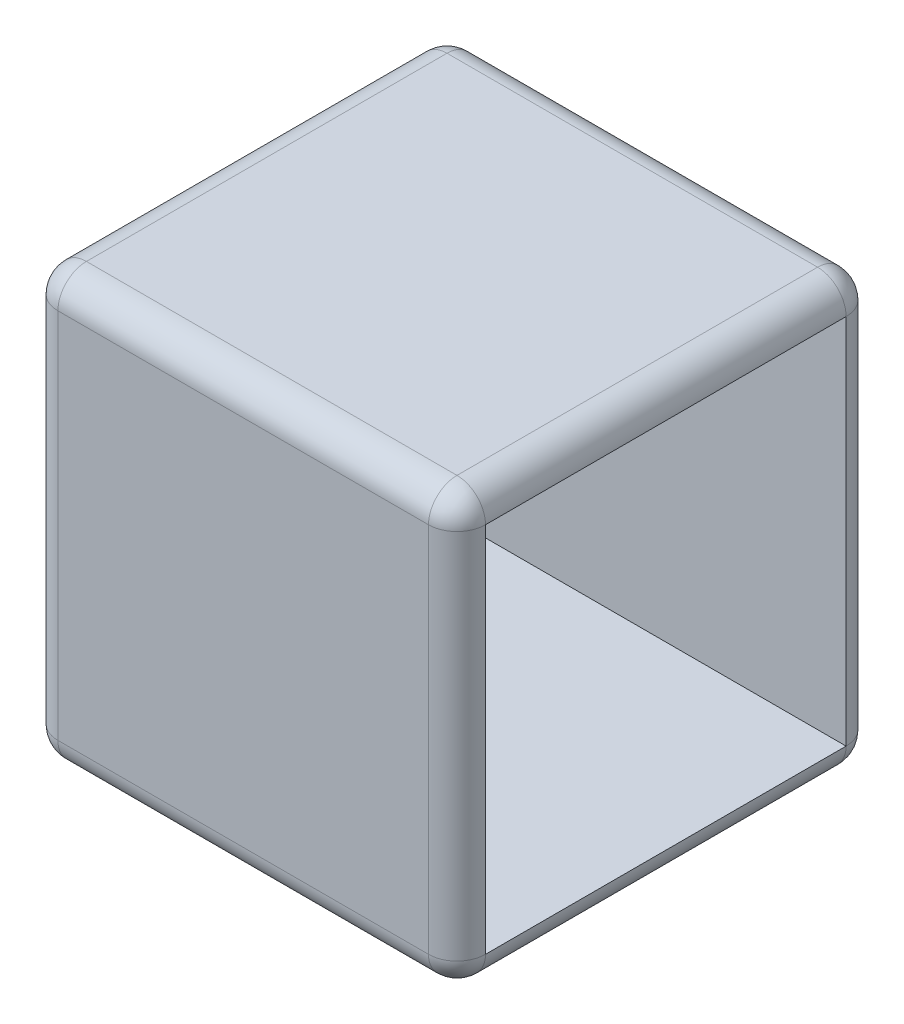
ISO-10303-21;
HEADER;
FILE_DESCRIPTION(('STEP AP214'),'2;1');
FILE_NAME('part.step','',(''),(''),'','','');
FILE_SCHEMA(('AUTOMOTIVE_DESIGN { 1 0 10303 214 1 1 1 1 }'));
ENDSEC;
DATA;
#1=APPLICATION_CONTEXT('core data for automotive mechanical design processes');
#2=APPLICATION_PROTOCOL_DEFINITION('international standard','automotive_design',2000,#1);
#3=PRODUCT_CONTEXT('',#1,'mechanical');
#4=PRODUCT('Part','Part','',(#3));
#5=PRODUCT_RELATED_PRODUCT_CATEGORY('part','',(#4));
#6=PRODUCT_DEFINITION_FORMATION('','',#4);
#7=PRODUCT_DEFINITION_CONTEXT('part definition',#1,'design');
#8=PRODUCT_DEFINITION('design','',#6,#7);
#9=PRODUCT_DEFINITION_SHAPE('','',#8);
#10=(LENGTH_UNIT() NAMED_UNIT(*) SI_UNIT(.MILLI.,.METRE.));
#11=(NAMED_UNIT(*) PLANE_ANGLE_UNIT() SI_UNIT($,.RADIAN.));
#12=(NAMED_UNIT(*) SI_UNIT($,.STERADIAN.) SOLID_ANGLE_UNIT());
#13=UNCERTAINTY_MEASURE_WITH_UNIT(LENGTH_MEASURE(1.E-05),#10,'distance_accuracy_value','');
#14=(GEOMETRIC_REPRESENTATION_CONTEXT(3) GLOBAL_UNCERTAINTY_ASSIGNED_CONTEXT((#13)) GLOBAL_UNIT_ASSIGNED_CONTEXT((#10,
#11,#12)) REPRESENTATION_CONTEXT('',''));
#15=CARTESIAN_POINT('',(0.,0.,0.));
#16=DIRECTION('',(0.,0.,1.));
#17=DIRECTION('',(1.,0.,0.));
#18=AXIS2_PLACEMENT_3D('',#15,#16,#17);
#19=CARTESIAN_POINT('',(15.,30.1,14.6499999999998));
#20=DIRECTION('',(0.,0.,1.));
#21=DIRECTION('',(1.,0.,0.));
#22=AXIS2_PLACEMENT_3D('',#19,#20,#21);
#23=PLANE('',#22);
#24=DIRECTION('',(-1.,0.,0.));
#25=VECTOR('',#24,1.);
#26=CARTESIAN_POINT('',(-15.,28.1,14.6499999999998));
#27=LINE('',#26,#25);
#28=CARTESIAN_POINT('',(13.,28.1,14.6499999999998));
#29=VERTEX_POINT('',#28);
#30=CARTESIAN_POINT('',(-13.,28.1,14.6499999999998));
#31=VERTEX_POINT('',#30);
#32=EDGE_CURVE('E207',#29,#31,#27,.T.);
#33=ORIENTED_EDGE('',*,*,#32,.T.);
#34=DIRECTION('',(0.,-1.,0.));
#35=VECTOR('',#34,1.);
#36=CARTESIAN_POINT('',(-13.,30.1,14.6499999999998));
#37=LINE('',#36,#35);
#38=CARTESIAN_POINT('',(-13.,2.,14.6499999999998));
#39=VERTEX_POINT('',#38);
#40=EDGE_CURVE('E209',#31,#39,#37,.T.);
#41=ORIENTED_EDGE('',*,*,#40,.T.);
#42=DIRECTION('',(-1.,0.,0.));
#43=VECTOR('',#42,1.);
#44=CARTESIAN_POINT('',(15.,2.,14.6499999999998));
#45=LINE('',#44,#43);
#46=CARTESIAN_POINT('',(13.,2.,14.6499999999998));
#47=VERTEX_POINT('',#46);
#48=EDGE_CURVE('E203',#39,#47,#45,.F.);
#49=ORIENTED_EDGE('',*,*,#48,.T.);
#50=DIRECTION('',(0.,-1.,0.));
#51=VECTOR('',#50,1.);
#52=CARTESIAN_POINT('',(13.,30.1,14.6499999999998));
#53=LINE('',#52,#51);
#54=EDGE_CURVE('E205',#47,#29,#53,.F.);
#55=ORIENTED_EDGE('',*,*,#54,.T.);
#56=EDGE_LOOP('',(#33,#41,#49,#55));
#57=FACE_BOUND('',#56,.T.);
#58=ADVANCED_FACE('F40',(#57),#23,.T.);
#59=CARTESIAN_POINT('',(15.,30.1,-14.6500000000001));
#60=DIRECTION('',(0.,0.,1.));
#61=DIRECTION('',(1.,0.,0.));
#62=AXIS2_PLACEMENT_3D('',#59,#60,#61);
#63=PLANE('',#62);
#64=DIRECTION('',(-1.,0.,0.));
#65=VECTOR('',#64,1.);
#66=CARTESIAN_POINT('',(15.,28.1,-14.6500000000001));
#67=LINE('',#66,#65);
#68=CARTESIAN_POINT('',(-13.,28.1,-14.6500000000001));
#69=VERTEX_POINT('',#68);
#70=CARTESIAN_POINT('',(13.,28.1,-14.6500000000001));
#71=VERTEX_POINT('',#70);
#72=EDGE_CURVE('E49',#69,#71,#67,.F.);
#73=ORIENTED_EDGE('',*,*,#72,.T.);
#74=DIRECTION('',(0.,-1.,0.));
#75=VECTOR('',#74,1.);
#76=CARTESIAN_POINT('',(13.,30.1,-14.6500000000001));
#77=LINE('',#76,#75);
#78=CARTESIAN_POINT('',(13.,2.,-14.6500000000001));
#79=VERTEX_POINT('',#78);
#80=EDGE_CURVE('E11',#71,#79,#77,.T.);
#81=ORIENTED_EDGE('',*,*,#80,.T.);
#82=DIRECTION('',(-1.,0.,0.));
#83=VECTOR('',#82,1.);
#84=CARTESIAN_POINT('',(-15.,2.,-14.6500000000001));
#85=LINE('',#84,#83);
#86=CARTESIAN_POINT('',(-13.,2.,-14.6500000000001));
#87=VERTEX_POINT('',#86);
#88=EDGE_CURVE('E221',#79,#87,#85,.T.);
#89=ORIENTED_EDGE('',*,*,#88,.T.);
#90=DIRECTION('',(0.,-1.,0.));
#91=VECTOR('',#90,1.);
#92=CARTESIAN_POINT('',(-13.,30.1,-14.6500000000001));
#93=LINE('',#92,#91);
#94=EDGE_CURVE('E60',#87,#69,#93,.F.);
#95=ORIENTED_EDGE('',*,*,#94,.T.);
#96=EDGE_LOOP('',(#73,#81,#89,#95));
#97=FACE_BOUND('',#96,.T.);
#98=ADVANCED_FACE('F300',(#97),#63,.F.);
#99=CARTESIAN_POINT('',(-15.,30.1,14.6499999999998));
#100=DIRECTION('',(-1.,0.,0.));
#101=DIRECTION('',(0.,0.,1.));
#102=AXIS2_PLACEMENT_3D('',#99,#100,#101);
#103=PLANE('',#102);
#104=DIRECTION('',(0.,-1.,0.));
#105=VECTOR('',#104,1.);
#106=CARTESIAN_POINT('',(-15.,30.1,12.6499999999998));
#107=LINE('',#106,#105);
#108=CARTESIAN_POINT('',(-15.,2.,12.6499999999998));
#109=VERTEX_POINT('',#108);
#110=CARTESIAN_POINT('',(-15.,28.1,12.6499999999998));
#111=VERTEX_POINT('',#110);
#112=EDGE_CURVE('E189',#109,#111,#107,.F.);
#113=ORIENTED_EDGE('',*,*,#112,.T.);
#114=DIRECTION('',(0.,0.,-1.));
#115=VECTOR('',#114,1.);
#116=CARTESIAN_POINT('',(-15.,28.1,-14.6500000000001));
#117=LINE('',#116,#115);
#118=CARTESIAN_POINT('',(-15.,28.1,-12.6500000000001));
#119=VERTEX_POINT('',#118);
#120=EDGE_CURVE('E191',#111,#119,#117,.T.);
#121=ORIENTED_EDGE('',*,*,#120,.T.);
#122=DIRECTION('',(0.,-1.,0.));
#123=VECTOR('',#122,1.);
#124=CARTESIAN_POINT('',(-15.,0.,-12.6500000000001));
#125=LINE('',#124,#123);
#126=CARTESIAN_POINT('',(-15.,2.,-12.6500000000001));
#127=VERTEX_POINT('',#126);
#128=EDGE_CURVE('E180',#119,#127,#125,.T.);
#129=ORIENTED_EDGE('',*,*,#128,.T.);
#130=DIRECTION('',(0.,0.,-1.));
#131=VECTOR('',#130,1.);
#132=CARTESIAN_POINT('',(-15.,2.,14.6499999999998));
#133=LINE('',#132,#131);
#134=EDGE_CURVE('E187',#127,#109,#133,.F.);
#135=ORIENTED_EDGE('',*,*,#134,.T.);
#136=EDGE_LOOP('',(#113,#121,#129,#135));
#137=FACE_BOUND('',#136,.T.);
#138=ADVANCED_FACE('F344',(#137),#103,.T.);
#139=CARTESIAN_POINT('',(0.,30.1,0.));
#140=DIRECTION('',(0.,-1.,0.));
#141=DIRECTION('',(0.,0.,-1.));
#142=AXIS2_PLACEMENT_3D('',#139,#140,#141);
#143=PLANE('',#142);
#144=DIRECTION('',(0.,0.,-1.));
#145=VECTOR('',#144,1.);
#146=CARTESIAN_POINT('',(-13.,30.1,14.6499999999998));
#147=LINE('',#146,#145);
#148=CARTESIAN_POINT('',(-13.,30.1,-12.6500000000001));
#149=VERTEX_POINT('',#148);
#150=CARTESIAN_POINT('',(-13.,30.1,12.6499999999998));
#151=VERTEX_POINT('',#150);
#152=EDGE_CURVE('E198',#149,#151,#147,.F.);
#153=ORIENTED_EDGE('',*,*,#152,.T.);
#154=DIRECTION('',(-1.,0.,0.));
#155=VECTOR('',#154,1.);
#156=CARTESIAN_POINT('',(15.,30.1,12.6499999999998));
#157=LINE('',#156,#155);
#158=CARTESIAN_POINT('',(13.,30.1,12.6499999999998));
#159=VERTEX_POINT('',#158);
#160=EDGE_CURVE('E201',#151,#159,#157,.F.);
#161=ORIENTED_EDGE('',*,*,#160,.T.);
#162=DIRECTION('',(0.,0.,-1.));
#163=VECTOR('',#162,1.);
#164=CARTESIAN_POINT('',(13.,30.1,0.));
#165=LINE('',#164,#163);
#166=CARTESIAN_POINT('',(13.,30.1,-12.6500000000001));
#167=VERTEX_POINT('',#166);
#168=EDGE_CURVE('E196',#159,#167,#165,.T.);
#169=ORIENTED_EDGE('',*,*,#168,.T.);
#170=DIRECTION('',(-1.,0.,0.));
#171=VECTOR('',#170,1.);
#172=CARTESIAN_POINT('',(0.,30.1,-12.6500000000001));
#173=LINE('',#172,#171);
#174=EDGE_CURVE('E194',#167,#149,#173,.T.);
#175=ORIENTED_EDGE('',*,*,#174,.T.);
#176=EDGE_LOOP('',(#153,#161,#169,#175));
#177=FACE_BOUND('',#176,.T.);
#178=ADVANCED_FACE('F315',(#177),#143,.F.);
#179=CARTESIAN_POINT('',(0.,0.,0.));
#180=DIRECTION('',(0.,-1.,0.));
#181=DIRECTION('',(0.,0.,-1.));
#182=AXIS2_PLACEMENT_3D('',#179,#180,#181);
#183=PLANE('',#182);
#184=DIRECTION('',(0.,0.,-1.));
#185=VECTOR('',#184,1.);
#186=CARTESIAN_POINT('',(13.,0.,14.6499999999998));
#187=LINE('',#186,#185);
#188=CARTESIAN_POINT('',(13.,0.,-12.6500000000001));
#189=VERTEX_POINT('',#188);
#190=CARTESIAN_POINT('',(13.,0.,12.6499999999998));
#191=VERTEX_POINT('',#190);
#192=EDGE_CURVE('E216',#189,#191,#187,.F.);
#193=ORIENTED_EDGE('',*,*,#192,.T.);
#194=DIRECTION('',(-1.,0.,0.));
#195=VECTOR('',#194,1.);
#196=CARTESIAN_POINT('',(0.,0.,12.6499999999998));
#197=LINE('',#196,#195);
#198=CARTESIAN_POINT('',(-13.,0.,12.6499999999998));
#199=VERTEX_POINT('',#198);
#200=EDGE_CURVE('E219',#191,#199,#197,.T.);
#201=ORIENTED_EDGE('',*,*,#200,.T.);
#202=DIRECTION('',(0.,0.,-1.));
#203=VECTOR('',#202,1.);
#204=CARTESIAN_POINT('',(-13.,0.,0.));
#205=LINE('',#204,#203);
#206=CARTESIAN_POINT('',(-13.,0.,-12.6500000000001));
#207=VERTEX_POINT('',#206);
#208=EDGE_CURVE('E214',#199,#207,#205,.T.);
#209=ORIENTED_EDGE('',*,*,#208,.T.);
#210=DIRECTION('',(-1.,0.,0.));
#211=VECTOR('',#210,1.);
#212=CARTESIAN_POINT('',(15.,0.,-12.6500000000001));
#213=LINE('',#212,#211);
#214=EDGE_CURVE('E212',#207,#189,#213,.F.);
#215=ORIENTED_EDGE('',*,*,#214,.T.);
#216=EDGE_LOOP('',(#193,#201,#209,#215));
#217=FACE_BOUND('',#216,.T.);
#218=ADVANCED_FACE('F335',(#217),#183,.T.);
#219=CARTESIAN_POINT('',(15.,30.1,12.6499999999998));
#220=DIRECTION('',(0.,0.,1.));
#221=DIRECTION('',(1.,0.,0.));
#222=AXIS2_PLACEMENT_3D('',#219,#220,#221);
#223=PLANE('',#222);
#224=DIRECTION('',(-1.,0.,0.));
#225=VECTOR('',#224,1.);
#226=CARTESIAN_POINT('',(0.,2.,12.6499999999998));
#227=LINE('',#226,#225);
#228=CARTESIAN_POINT('',(15.,2.,12.6499999999998));
#229=VERTEX_POINT('',#228);
#230=CARTESIAN_POINT('',(-13.,2.,12.6499999999998));
#231=VERTEX_POINT('',#230);
#232=EDGE_CURVE('E158',#229,#231,#227,.T.);
#233=ORIENTED_EDGE('',*,*,#232,.T.);
#234=DIRECTION('',(0.,-1.,0.));
#235=VECTOR('',#234,1.);
#236=CARTESIAN_POINT('',(-13.,30.1,12.6499999999998));
#237=LINE('',#236,#235);
#238=CARTESIAN_POINT('',(-13.,28.1,12.6499999999998));
#239=VERTEX_POINT('',#238);
#240=EDGE_CURVE('E140',#239,#231,#237,.T.);
#241=ORIENTED_EDGE('',*,*,#240,.F.);
#242=DIRECTION('',(-1.,0.,0.));
#243=VECTOR('',#242,1.);
#244=CARTESIAN_POINT('',(0.,28.1,12.6499999999998));
#245=LINE('',#244,#243);
#246=CARTESIAN_POINT('',(15.,28.1,12.6499999999998));
#247=VERTEX_POINT('',#246);
#248=EDGE_CURVE('E170',#247,#239,#245,.T.);
#249=ORIENTED_EDGE('',*,*,#248,.F.);
#250=DIRECTION('',(0.,-1.,0.));
#251=VECTOR('',#250,1.);
#252=CARTESIAN_POINT('',(15.,30.1,12.6499999999998));
#253=LINE('',#252,#251);
#254=EDGE_CURVE('E165',#247,#229,#253,.T.);
#255=ORIENTED_EDGE('',*,*,#254,.T.);
#256=EDGE_LOOP('',(#233,#241,#249,#255));
#257=FACE_BOUND('',#256,.T.);
#258=ADVANCED_FACE('F163',(#257),#223,.F.);
#259=CARTESIAN_POINT('',(15.,30.1,-12.6500000000001));
#260=DIRECTION('',(0.,0.,1.));
#261=DIRECTION('',(1.,0.,0.));
#262=AXIS2_PLACEMENT_3D('',#259,#260,#261);
#263=PLANE('',#262);
#264=DIRECTION('',(-1.,0.,0.));
#265=VECTOR('',#264,1.);
#266=CARTESIAN_POINT('',(0.,2.,-12.6500000000001));
#267=LINE('',#266,#265);
#268=CARTESIAN_POINT('',(15.,2.,-12.6500000000001));
#269=VERTEX_POINT('',#268);
#270=CARTESIAN_POINT('',(-13.,2.,-12.6500000000001));
#271=VERTEX_POINT('',#270);
#272=EDGE_CURVE('E161',#269,#271,#267,.T.);
#273=ORIENTED_EDGE('',*,*,#272,.F.);
#274=DIRECTION('',(0.,-1.,0.));
#275=VECTOR('',#274,1.);
#276=CARTESIAN_POINT('',(15.,30.1,-12.6500000000001));
#277=LINE('',#276,#275);
#278=CARTESIAN_POINT('',(15.,28.1,-12.6500000000001));
#279=VERTEX_POINT('',#278);
#280=EDGE_CURVE('E176',#279,#269,#277,.T.);
#281=ORIENTED_EDGE('',*,*,#280,.F.);
#282=DIRECTION('',(-1.,0.,0.));
#283=VECTOR('',#282,1.);
#284=CARTESIAN_POINT('',(0.,28.1,-12.6500000000001));
#285=LINE('',#284,#283);
#286=CARTESIAN_POINT('',(-13.,28.1,-12.6500000000001));
#287=VERTEX_POINT('',#286);
#288=EDGE_CURVE('E174',#279,#287,#285,.T.);
#289=ORIENTED_EDGE('',*,*,#288,.T.);
#290=DIRECTION('',(0.,-1.,0.));
#291=VECTOR('',#290,1.);
#292=CARTESIAN_POINT('',(-13.,30.1,-12.6500000000001));
#293=LINE('',#292,#291);
#294=EDGE_CURVE('E151',#287,#271,#293,.T.);
#295=ORIENTED_EDGE('',*,*,#294,.T.);
#296=EDGE_LOOP('',(#273,#281,#289,#295));
#297=FACE_BOUND('',#296,.T.);
#298=ADVANCED_FACE('F326',(#297),#263,.T.);
#299=CARTESIAN_POINT('',(-13.,30.1,14.6499999999998));
#300=DIRECTION('',(-1.,0.,0.));
#301=DIRECTION('',(0.,0.,1.));
#302=AXIS2_PLACEMENT_3D('',#299,#300,#301);
#303=PLANE('',#302);
#304=DIRECTION('',(0.,0.,-1.));
#305=VECTOR('',#304,1.);
#306=CARTESIAN_POINT('',(-13.,2.,0.));
#307=LINE('',#306,#305);
#308=EDGE_CURVE('E144',#231,#271,#307,.T.);
#309=ORIENTED_EDGE('',*,*,#308,.T.);
#310=ORIENTED_EDGE('',*,*,#294,.F.);
#311=DIRECTION('',(0.,0.,-1.));
#312=VECTOR('',#311,1.);
#313=CARTESIAN_POINT('',(-13.,28.1,0.));
#314=LINE('',#313,#312);
#315=EDGE_CURVE('E146',#239,#287,#314,.T.);
#316=ORIENTED_EDGE('',*,*,#315,.F.);
#317=ORIENTED_EDGE('',*,*,#240,.T.);
#318=EDGE_LOOP('',(#309,#310,#316,#317));
#319=FACE_BOUND('',#318,.T.);
#320=ADVANCED_FACE('F142',(#319),#303,.F.);
#321=CARTESIAN_POINT('',(0.,28.1,0.));
#322=DIRECTION('',(0.,-1.,0.));
#323=DIRECTION('',(0.,0.,-1.));
#324=AXIS2_PLACEMENT_3D('',#321,#322,#323);
#325=PLANE('',#324);
#326=ORIENTED_EDGE('',*,*,#248,.T.);
#327=ORIENTED_EDGE('',*,*,#315,.T.);
#328=ORIENTED_EDGE('',*,*,#288,.F.);
#329=DIRECTION('',(0.,0.,-1.));
#330=VECTOR('',#329,1.);
#331=CARTESIAN_POINT('',(15.,28.1,0.));
#332=LINE('',#331,#330);
#333=EDGE_CURVE('E152',#247,#279,#332,.T.);
#334=ORIENTED_EDGE('',*,*,#333,.F.);
#335=EDGE_LOOP('',(#326,#327,#328,#334));
#336=FACE_BOUND('',#335,.T.);
#337=ADVANCED_FACE('F324',(#336),#325,.T.);
#338=CARTESIAN_POINT('',(0.,2.,0.));
#339=DIRECTION('',(0.,-1.,0.));
#340=DIRECTION('',(0.,0.,-1.));
#341=AXIS2_PLACEMENT_3D('',#338,#339,#340);
#342=PLANE('',#341);
#343=ORIENTED_EDGE('',*,*,#232,.F.);
#344=DIRECTION('',(0.,0.,-1.));
#345=VECTOR('',#344,1.);
#346=CARTESIAN_POINT('',(15.,2.,0.));
#347=LINE('',#346,#345);
#348=EDGE_CURVE('E171',#229,#269,#347,.T.);
#349=ORIENTED_EDGE('',*,*,#348,.T.);
#350=ORIENTED_EDGE('',*,*,#272,.T.);
#351=ORIENTED_EDGE('',*,*,#308,.F.);
#352=EDGE_LOOP('',(#343,#349,#350,#351));
#353=FACE_BOUND('',#352,.T.);
#354=ADVANCED_FACE('F157',(#353),#342,.F.);
#355=CARTESIAN_POINT('',(13.,2.,14.6499999999998));
#356=DIRECTION('',(0.,0.,1.));
#357=DIRECTION('',(1.,0.,0.));
#358=AXIS2_PLACEMENT_3D('',#355,#356,#357);
#359=CYLINDRICAL_SURFACE('',#358,2.);
#360=CARTESIAN_POINT('',(13.,2.,12.6499999999998));
#361=DIRECTION('',(0.,0.,1.));
#362=DIRECTION('',(1.,0.,0.));
#363=AXIS2_PLACEMENT_3D('',#360,#361,#362);
#364=CIRCLE('',#363,2.);
#365=EDGE_CURVE('E44',#191,#229,#364,.T.);
#366=ORIENTED_EDGE('',*,*,#365,.F.);
#367=ORIENTED_EDGE('',*,*,#192,.F.);
#368=CARTESIAN_POINT('',(13.,2.,-12.6500000000001));
#369=DIRECTION('',(0.,0.,-1.));
#370=DIRECTION('',(-1.,0.,0.));
#371=AXIS2_PLACEMENT_3D('',#368,#369,#370);
#372=CIRCLE('',#371,2.);
#373=EDGE_CURVE('E168',#269,#189,#372,.T.);
#374=ORIENTED_EDGE('',*,*,#373,.F.);
#375=ORIENTED_EDGE('',*,*,#348,.F.);
#376=EDGE_LOOP('',(#366,#367,#374,#375));
#377=FACE_BOUND('',#376,.T.);
#378=ADVANCED_FACE('F42',(#377),#359,.T.);
#379=CARTESIAN_POINT('',(13.,2.,12.6499999999998));
#380=DIRECTION('',(1.,0.,0.));
#381=DIRECTION('',(0.,1.,0.));
#382=AXIS2_PLACEMENT_3D('',#379,#380,#381);
#383=SPHERICAL_SURFACE('',#382,2.);
#384=CARTESIAN_POINT('',(13.,2.,12.6499999999998));
#385=DIRECTION('',(1.,0.,0.));
#386=DIRECTION('',(0.,0.,-1.));
#387=AXIS2_PLACEMENT_3D('',#384,#385,#386);
#388=CIRCLE('',#387,2.);
#389=EDGE_CURVE('E281',#191,#47,#388,.F.);
#390=ORIENTED_EDGE('',*,*,#389,.F.);
#391=ORIENTED_EDGE('',*,*,#365,.T.);
#392=CARTESIAN_POINT('',(13.,2.,12.6499999999998));
#393=DIRECTION('',(0.,-1.,0.));
#394=DIRECTION('',(0.,0.,-1.));
#395=AXIS2_PLACEMENT_3D('',#392,#393,#394);
#396=CIRCLE('',#395,2.);
#397=EDGE_CURVE('E284',#47,#229,#396,.F.);
#398=ORIENTED_EDGE('',*,*,#397,.F.);
#399=EDGE_LOOP('',(#390,#391,#398));
#400=FACE_BOUND('',#399,.T.);
#401=ADVANCED_FACE('F407',(#400),#383,.T.);
#402=CARTESIAN_POINT('',(13.,2.,-12.6500000000001));
#403=DIRECTION('',(0.,-1.,0.));
#404=DIRECTION('',(0.,0.,-1.));
#405=AXIS2_PLACEMENT_3D('',#402,#403,#404);
#406=SPHERICAL_SURFACE('',#405,2.);
#407=CARTESIAN_POINT('',(13.,2.,-12.6500000000001));
#408=DIRECTION('',(0.,-1.,0.));
#409=DIRECTION('',(0.,0.,-1.));
#410=AXIS2_PLACEMENT_3D('',#407,#408,#409);
#411=CIRCLE('',#410,2.);
#412=EDGE_CURVE('E275',#269,#79,#411,.F.);
#413=ORIENTED_EDGE('',*,*,#412,.F.);
#414=ORIENTED_EDGE('',*,*,#373,.T.);
#415=CARTESIAN_POINT('',(13.,2.,-12.6500000000001));
#416=DIRECTION('',(1.,0.,0.));
#417=DIRECTION('',(0.,0.,-1.));
#418=AXIS2_PLACEMENT_3D('',#415,#416,#417);
#419=CIRCLE('',#418,2.);
#420=EDGE_CURVE('E278',#79,#189,#419,.F.);
#421=ORIENTED_EDGE('',*,*,#420,.F.);
#422=EDGE_LOOP('',(#413,#414,#421));
#423=FACE_BOUND('',#422,.T.);
#424=ADVANCED_FACE('F291',(#423),#406,.T.);
#425=CARTESIAN_POINT('',(13.,30.1,12.6499999999998));
#426=DIRECTION('',(0.,1.,0.));
#427=DIRECTION('',(0.,0.,1.));
#428=AXIS2_PLACEMENT_3D('',#425,#426,#427);
#429=CYLINDRICAL_SURFACE('',#428,2.);
#430=ORIENTED_EDGE('',*,*,#397,.T.);
#431=ORIENTED_EDGE('',*,*,#254,.F.);
#432=CARTESIAN_POINT('',(13.,28.1,12.6499999999998));
#433=DIRECTION('',(0.,1.,0.));
#434=DIRECTION('',(0.,0.,1.));
#435=AXIS2_PLACEMENT_3D('',#432,#433,#434);
#436=CIRCLE('',#435,2.);
#437=EDGE_CURVE('E270',#29,#247,#436,.T.);
#438=ORIENTED_EDGE('',*,*,#437,.F.);
#439=ORIENTED_EDGE('',*,*,#54,.F.);
#440=EDGE_LOOP('',(#430,#431,#438,#439));
#441=FACE_BOUND('',#440,.T.);
#442=ADVANCED_FACE('F401',(#441),#429,.T.);
#443=CARTESIAN_POINT('',(0.,2.,12.6499999999998));
#444=DIRECTION('',(-1.,0.,0.));
#445=DIRECTION('',(0.,0.,1.));
#446=AXIS2_PLACEMENT_3D('',#443,#444,#445);
#447=CYLINDRICAL_SURFACE('',#446,2.);
#448=ORIENTED_EDGE('',*,*,#389,.T.);
#449=ORIENTED_EDGE('',*,*,#48,.F.);
#450=CARTESIAN_POINT('',(-13.,2.,12.6499999999998));
#451=DIRECTION('',(-1.,0.,0.));
#452=DIRECTION('',(0.,0.,1.));
#453=AXIS2_PLACEMENT_3D('',#450,#451,#452);
#454=CIRCLE('',#453,2.);
#455=EDGE_CURVE('E267',#199,#39,#454,.T.);
#456=ORIENTED_EDGE('',*,*,#455,.F.);
#457=ORIENTED_EDGE('',*,*,#200,.F.);
#458=EDGE_LOOP('',(#448,#449,#456,#457));
#459=FACE_BOUND('',#458,.T.);
#460=ADVANCED_FACE('F397',(#459),#447,.T.);
#461=CARTESIAN_POINT('',(-13.,2.,0.));
#462=DIRECTION('',(0.,0.,-1.));
#463=DIRECTION('',(-1.,0.,0.));
#464=AXIS2_PLACEMENT_3D('',#461,#462,#463);
#465=CYLINDRICAL_SURFACE('',#464,2.);
#466=CARTESIAN_POINT('',(-13.,2.,-12.6500000000001));
#467=DIRECTION('',(0.,0.,-1.));
#468=DIRECTION('',(-1.,0.,0.));
#469=AXIS2_PLACEMENT_3D('',#466,#467,#468);
#470=CIRCLE('',#469,2.);
#471=EDGE_CURVE('E261',#207,#127,#470,.T.);
#472=ORIENTED_EDGE('',*,*,#471,.F.);
#473=ORIENTED_EDGE('',*,*,#208,.F.);
#474=CARTESIAN_POINT('',(-13.,2.,12.6499999999998));
#475=DIRECTION('',(0.,0.,1.));
#476=DIRECTION('',(1.,0.,0.));
#477=AXIS2_PLACEMENT_3D('',#474,#475,#476);
#478=CIRCLE('',#477,2.);
#479=EDGE_CURVE('E264',#109,#199,#478,.T.);
#480=ORIENTED_EDGE('',*,*,#479,.F.);
#481=ORIENTED_EDGE('',*,*,#134,.F.);
#482=EDGE_LOOP('',(#472,#473,#480,#481));
#483=FACE_BOUND('',#482,.T.);
#484=ADVANCED_FACE('F394',(#483),#465,.T.);
#485=CARTESIAN_POINT('',(15.,2.,-12.6500000000001));
#486=DIRECTION('',(1.,0.,0.));
#487=DIRECTION('',(0.,0.,-1.));
#488=AXIS2_PLACEMENT_3D('',#485,#486,#487);
#489=CYLINDRICAL_SURFACE('',#488,2.);
#490=ORIENTED_EDGE('',*,*,#420,.T.);
#491=ORIENTED_EDGE('',*,*,#214,.F.);
#492=CARTESIAN_POINT('',(-13.,2.,-12.6500000000001));
#493=DIRECTION('',(-1.,0.,0.));
#494=DIRECTION('',(0.,0.,1.));
#495=AXIS2_PLACEMENT_3D('',#492,#493,#494);
#496=CIRCLE('',#495,2.);
#497=EDGE_CURVE('E258',#87,#207,#496,.T.);
#498=ORIENTED_EDGE('',*,*,#497,.F.);
#499=ORIENTED_EDGE('',*,*,#88,.F.);
#500=EDGE_LOOP('',(#490,#491,#498,#499));
#501=FACE_BOUND('',#500,.T.);
#502=ADVANCED_FACE('F296',(#501),#489,.T.);
#503=CARTESIAN_POINT('',(13.,30.1,-12.6500000000001));
#504=DIRECTION('',(0.,-1.,0.));
#505=DIRECTION('',(0.,0.,-1.));
#506=AXIS2_PLACEMENT_3D('',#503,#504,#505);
#507=CYLINDRICAL_SURFACE('',#506,2.);
#508=ORIENTED_EDGE('',*,*,#412,.T.);
#509=ORIENTED_EDGE('',*,*,#80,.F.);
#510=CARTESIAN_POINT('',(13.,28.1,-12.6500000000001));
#511=DIRECTION('',(0.,1.,0.));
#512=DIRECTION('',(0.,0.,1.));
#513=AXIS2_PLACEMENT_3D('',#510,#511,#512);
#514=CIRCLE('',#513,2.);
#515=EDGE_CURVE('E255',#279,#71,#514,.T.);
#516=ORIENTED_EDGE('',*,*,#515,.F.);
#517=ORIENTED_EDGE('',*,*,#280,.T.);
#518=EDGE_LOOP('',(#508,#509,#516,#517));
#519=FACE_BOUND('',#518,.T.);
#520=ADVANCED_FACE('F303',(#519),#507,.T.);
#521=CARTESIAN_POINT('',(13.,28.1,0.));
#522=DIRECTION('',(0.,0.,-1.));
#523=DIRECTION('',(-1.,0.,0.));
#524=AXIS2_PLACEMENT_3D('',#521,#522,#523);
#525=CYLINDRICAL_SURFACE('',#524,2.);
#526=CARTESIAN_POINT('',(13.,28.1,12.6499999999998));
#527=DIRECTION('',(0.,0.,1.));
#528=DIRECTION('',(1.,0.,0.));
#529=AXIS2_PLACEMENT_3D('',#526,#527,#528);
#530=CIRCLE('',#529,2.);
#531=EDGE_CURVE('E272',#247,#159,#530,.T.);
#532=ORIENTED_EDGE('',*,*,#531,.F.);
#533=ORIENTED_EDGE('',*,*,#333,.T.);
#534=CARTESIAN_POINT('',(13.,28.1,-12.6500000000001));
#535=DIRECTION('',(0.,0.,-1.));
#536=DIRECTION('',(-1.,0.,0.));
#537=AXIS2_PLACEMENT_3D('',#534,#535,#536);
#538=CIRCLE('',#537,2.);
#539=EDGE_CURVE('E252',#167,#279,#538,.T.);
#540=ORIENTED_EDGE('',*,*,#539,.F.);
#541=ORIENTED_EDGE('',*,*,#168,.F.);
#542=EDGE_LOOP('',(#532,#533,#540,#541));
#543=FACE_BOUND('',#542,.T.);
#544=ADVANCED_FACE('F320',(#543),#525,.T.);
#545=CARTESIAN_POINT('',(13.,28.1,12.6499999999998));
#546=DIRECTION('',(1.,0.,0.));
#547=DIRECTION('',(0.,0.,-1.));
#548=AXIS2_PLACEMENT_3D('',#545,#546,#547);
#549=SPHERICAL_SURFACE('',#548,2.);
#550=ORIENTED_EDGE('',*,*,#437,.T.);
#551=ORIENTED_EDGE('',*,*,#531,.T.);
#552=CARTESIAN_POINT('',(13.,28.1,12.6499999999998));
#553=DIRECTION('',(1.,0.,0.));
#554=DIRECTION('',(0.,0.,-1.));
#555=AXIS2_PLACEMENT_3D('',#552,#553,#554);
#556=CIRCLE('',#555,2.);
#557=EDGE_CURVE('E249',#29,#159,#556,.F.);
#558=ORIENTED_EDGE('',*,*,#557,.F.);
#559=EDGE_LOOP('',(#550,#551,#558));
#560=FACE_BOUND('',#559,.T.);
#561=ADVANCED_FACE('F383',(#560),#549,.T.);
#562=CARTESIAN_POINT('',(-13.,2.,12.6499999999998));
#563=DIRECTION('',(0.,-1.,0.));
#564=DIRECTION('',(0.,0.,-1.));
#565=AXIS2_PLACEMENT_3D('',#562,#563,#564);
#566=SPHERICAL_SURFACE('',#565,2.);
#567=ORIENTED_EDGE('',*,*,#479,.T.);
#568=ORIENTED_EDGE('',*,*,#455,.T.);
#569=CARTESIAN_POINT('',(-13.,2.,12.6499999999998));
#570=DIRECTION('',(0.,-1.,0.));
#571=DIRECTION('',(0.,0.,-1.));
#572=AXIS2_PLACEMENT_3D('',#569,#570,#571);
#573=CIRCLE('',#572,2.);
#574=EDGE_CURVE('E247',#109,#39,#573,.F.);
#575=ORIENTED_EDGE('',*,*,#574,.F.);
#576=EDGE_LOOP('',(#567,#568,#575));
#577=FACE_BOUND('',#576,.T.);
#578=ADVANCED_FACE('F379',(#577),#566,.T.);
#579=CARTESIAN_POINT('',(-13.,2.,-12.6500000000001));
#580=DIRECTION('',(0.,-1.,0.));
#581=DIRECTION('',(0.,0.,-1.));
#582=AXIS2_PLACEMENT_3D('',#579,#580,#581);
#583=SPHERICAL_SURFACE('',#582,2.);
#584=ORIENTED_EDGE('',*,*,#497,.T.);
#585=ORIENTED_EDGE('',*,*,#471,.T.);
#586=CARTESIAN_POINT('',(-13.,2.,-12.6500000000001));
#587=DIRECTION('',(0.,-1.,0.));
#588=DIRECTION('',(0.,0.,-1.));
#589=AXIS2_PLACEMENT_3D('',#586,#587,#588);
#590=CIRCLE('',#589,2.);
#591=EDGE_CURVE('E244',#87,#127,#590,.F.);
#592=ORIENTED_EDGE('',*,*,#591,.F.);
#593=EDGE_LOOP('',(#584,#585,#592));
#594=FACE_BOUND('',#593,.T.);
#595=ADVANCED_FACE('F376',(#594),#583,.T.);
#596=CARTESIAN_POINT('',(13.,28.1,-12.6500000000001));
#597=DIRECTION('',(1.,0.,0.));
#598=DIRECTION('',(0.,0.,-1.));
#599=AXIS2_PLACEMENT_3D('',#596,#597,#598);
#600=SPHERICAL_SURFACE('',#599,2.);
#601=ORIENTED_EDGE('',*,*,#539,.T.);
#602=ORIENTED_EDGE('',*,*,#515,.T.);
#603=CARTESIAN_POINT('',(13.,28.1,-12.6500000000001));
#604=DIRECTION('',(1.,0.,0.));
#605=DIRECTION('',(0.,0.,-1.));
#606=AXIS2_PLACEMENT_3D('',#603,#604,#605);
#607=CIRCLE('',#606,2.);
#608=EDGE_CURVE('E241',#167,#71,#607,.F.);
#609=ORIENTED_EDGE('',*,*,#608,.F.);
#610=EDGE_LOOP('',(#601,#602,#609));
#611=FACE_BOUND('',#610,.T.);
#612=ADVANCED_FACE('F306',(#611),#600,.T.);
#613=CARTESIAN_POINT('',(15.,28.1,12.6499999999998));
#614=DIRECTION('',(1.,0.,0.));
#615=DIRECTION('',(0.,0.,-1.));
#616=AXIS2_PLACEMENT_3D('',#613,#614,#615);
#617=CYLINDRICAL_SURFACE('',#616,2.);
#618=ORIENTED_EDGE('',*,*,#557,.T.);
#619=ORIENTED_EDGE('',*,*,#160,.F.);
#620=CARTESIAN_POINT('',(-13.,28.1,12.6499999999998));
#621=DIRECTION('',(-1.,0.,0.));
#622=DIRECTION('',(0.,0.,1.));
#623=AXIS2_PLACEMENT_3D('',#620,#621,#622);
#624=CIRCLE('',#623,2.);
#625=EDGE_CURVE('E238',#31,#151,#624,.T.);
#626=ORIENTED_EDGE('',*,*,#625,.F.);
#627=ORIENTED_EDGE('',*,*,#32,.F.);
#628=EDGE_LOOP('',(#618,#619,#626,#627));
#629=FACE_BOUND('',#628,.T.);
#630=ADVANCED_FACE('F369',(#629),#617,.T.);
#631=CARTESIAN_POINT('',(-13.,30.1,12.6499999999998));
#632=DIRECTION('',(0.,-1.,0.));
#633=DIRECTION('',(0.,0.,-1.));
#634=AXIS2_PLACEMENT_3D('',#631,#632,#633);
#635=CYLINDRICAL_SURFACE('',#634,2.);
#636=ORIENTED_EDGE('',*,*,#574,.T.);
#637=ORIENTED_EDGE('',*,*,#40,.F.);
#638=CARTESIAN_POINT('',(-13.,28.1,12.6499999999998));
#639=DIRECTION('',(0.,1.,0.));
#640=DIRECTION('',(0.,0.,1.));
#641=AXIS2_PLACEMENT_3D('',#638,#639,#640);
#642=CIRCLE('',#641,2.);
#643=EDGE_CURVE('E235',#111,#31,#642,.T.);
#644=ORIENTED_EDGE('',*,*,#643,.F.);
#645=ORIENTED_EDGE('',*,*,#112,.F.);
#646=EDGE_LOOP('',(#636,#637,#644,#645));
#647=FACE_BOUND('',#646,.T.);
#648=ADVANCED_FACE('F365',(#647),#635,.T.);
#649=CARTESIAN_POINT('',(-13.,30.1,-12.6500000000001));
#650=DIRECTION('',(0.,1.,0.));
#651=DIRECTION('',(0.,0.,1.));
#652=AXIS2_PLACEMENT_3D('',#649,#650,#651);
#653=CYLINDRICAL_SURFACE('',#652,2.);
#654=ORIENTED_EDGE('',*,*,#591,.T.);
#655=ORIENTED_EDGE('',*,*,#128,.F.);
#656=CARTESIAN_POINT('',(-13.,28.1,-12.6500000000001));
#657=DIRECTION('',(0.,1.,0.));
#658=DIRECTION('',(0.,0.,1.));
#659=AXIS2_PLACEMENT_3D('',#656,#657,#658);
#660=CIRCLE('',#659,2.);
#661=EDGE_CURVE('E232',#69,#119,#660,.T.);
#662=ORIENTED_EDGE('',*,*,#661,.F.);
#663=ORIENTED_EDGE('',*,*,#94,.F.);
#664=EDGE_LOOP('',(#654,#655,#662,#663));
#665=FACE_BOUND('',#664,.T.);
#666=ADVANCED_FACE('F362',(#665),#653,.T.);
#667=CARTESIAN_POINT('',(0.,28.1,-12.6500000000001));
#668=DIRECTION('',(-1.,0.,0.));
#669=DIRECTION('',(0.,0.,1.));
#670=AXIS2_PLACEMENT_3D('',#667,#668,#669);
#671=CYLINDRICAL_SURFACE('',#670,2.);
#672=ORIENTED_EDGE('',*,*,#608,.T.);
#673=ORIENTED_EDGE('',*,*,#72,.F.);
#674=CARTESIAN_POINT('',(-13.,28.1,-12.6500000000001));
#675=DIRECTION('',(-1.,0.,0.));
#676=DIRECTION('',(0.,0.,1.));
#677=AXIS2_PLACEMENT_3D('',#674,#675,#676);
#678=CIRCLE('',#677,2.);
#679=EDGE_CURVE('E229',#149,#69,#678,.T.);
#680=ORIENTED_EDGE('',*,*,#679,.F.);
#681=ORIENTED_EDGE('',*,*,#174,.F.);
#682=EDGE_LOOP('',(#672,#673,#680,#681));
#683=FACE_BOUND('',#682,.T.);
#684=ADVANCED_FACE('F310',(#683),#671,.T.);
#685=CARTESIAN_POINT('',(-13.,28.1,12.6499999999998));
#686=DIRECTION('',(0.,0.,1.));
#687=DIRECTION('',(1.,0.,0.));
#688=AXIS2_PLACEMENT_3D('',#685,#686,#687);
#689=SPHERICAL_SURFACE('',#688,2.);
#690=ORIENTED_EDGE('',*,*,#643,.T.);
#691=ORIENTED_EDGE('',*,*,#625,.T.);
#692=CARTESIAN_POINT('',(-13.,28.1,12.6499999999998));
#693=DIRECTION('',(0.,0.,1.));
#694=DIRECTION('',(1.,0.,0.));
#695=AXIS2_PLACEMENT_3D('',#692,#693,#694);
#696=CIRCLE('',#695,2.);
#697=EDGE_CURVE('E227',#111,#151,#696,.F.);
#698=ORIENTED_EDGE('',*,*,#697,.F.);
#699=EDGE_LOOP('',(#690,#691,#698));
#700=FACE_BOUND('',#699,.T.);
#701=ADVANCED_FACE('F355',(#700),#689,.T.);
#702=CARTESIAN_POINT('',(-13.,28.1,-12.6500000000001));
#703=DIRECTION('',(0.,0.,-1.));
#704=DIRECTION('',(-1.,0.,0.));
#705=AXIS2_PLACEMENT_3D('',#702,#703,#704);
#706=SPHERICAL_SURFACE('',#705,2.);
#707=ORIENTED_EDGE('',*,*,#679,.T.);
#708=ORIENTED_EDGE('',*,*,#661,.T.);
#709=CARTESIAN_POINT('',(-13.,28.1,-12.6500000000001));
#710=DIRECTION('',(0.,0.,-1.));
#711=DIRECTION('',(0.,1.,0.));
#712=AXIS2_PLACEMENT_3D('',#709,#710,#711);
#713=CIRCLE('',#712,2.);
#714=EDGE_CURVE('E225',#149,#119,#713,.F.);
#715=ORIENTED_EDGE('',*,*,#714,.F.);
#716=EDGE_LOOP('',(#707,#708,#715));
#717=FACE_BOUND('',#716,.T.);
#718=ADVANCED_FACE('F351',(#717),#706,.T.);
#719=CARTESIAN_POINT('',(-13.,28.1,14.6499999999998));
#720=DIRECTION('',(0.,0.,1.));
#721=DIRECTION('',(1.,0.,0.));
#722=AXIS2_PLACEMENT_3D('',#719,#720,#721);
#723=CYLINDRICAL_SURFACE('',#722,2.);
#724=ORIENTED_EDGE('',*,*,#697,.T.);
#725=ORIENTED_EDGE('',*,*,#152,.F.);
#726=ORIENTED_EDGE('',*,*,#714,.T.);
#727=ORIENTED_EDGE('',*,*,#120,.F.);
#728=EDGE_LOOP('',(#724,#725,#726,#727));
#729=FACE_BOUND('',#728,.T.);
#730=ADVANCED_FACE('F348',(#729),#723,.T.);
#731=CLOSED_SHELL('',(#58,#98,#138,#178,#218,#258,#298,#320,#337,#354,#378,#401,#424,#442,#460,
#484,#502,#520,#544,#561,#578,#595,#612,#630,#648,#666,#684,#701,#718,#730));
#732=MANIFOLD_SOLID_BREP('B2',#731);
#733=ADVANCED_BREP_SHAPE_REPRESENTATION('',(#18,#732),#14);
#734=SHAPE_DEFINITION_REPRESENTATION(#9,#733);
ENDSEC;
END-ISO-10303-21;
